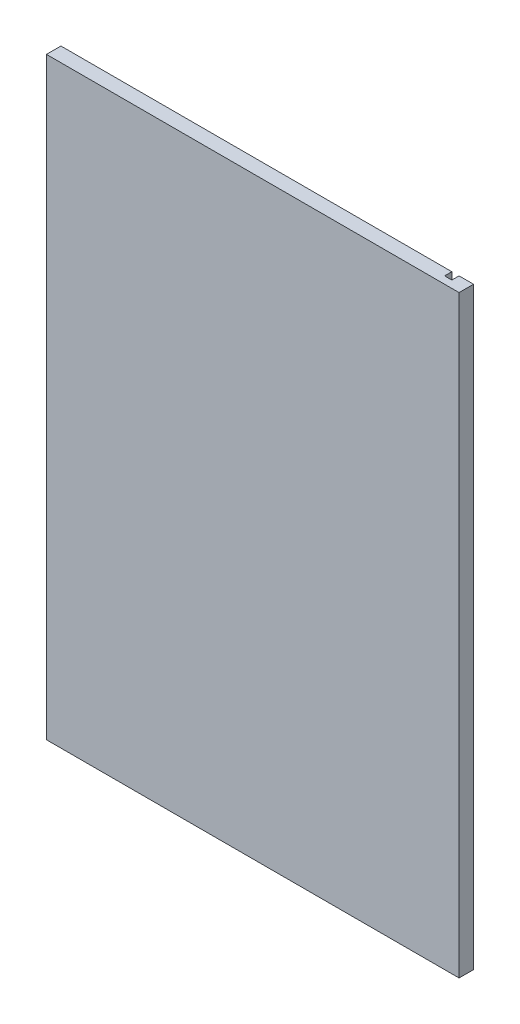
ISO-10303-21;
HEADER;
FILE_DESCRIPTION(('STEP AP214'),'2;1');
FILE_NAME('part.step','',(''),(''),'','','');
FILE_SCHEMA(('AUTOMOTIVE_DESIGN { 1 0 10303 214 1 1 1 1 }'));
ENDSEC;
DATA;
#1=APPLICATION_CONTEXT('core data for automotive mechanical design processes');
#2=APPLICATION_PROTOCOL_DEFINITION('international standard','automotive_design',2000,#1);
#3=PRODUCT_CONTEXT('',#1,'mechanical');
#4=PRODUCT('Part','Part','',(#3));
#5=PRODUCT_RELATED_PRODUCT_CATEGORY('part','',(#4));
#6=PRODUCT_DEFINITION_FORMATION('','',#4);
#7=PRODUCT_DEFINITION_CONTEXT('part definition',#1,'design');
#8=PRODUCT_DEFINITION('design','',#6,#7);
#9=PRODUCT_DEFINITION_SHAPE('','',#8);
#10=(LENGTH_UNIT() NAMED_UNIT(*) SI_UNIT(.MILLI.,.METRE.));
#11=(NAMED_UNIT(*) PLANE_ANGLE_UNIT() SI_UNIT($,.RADIAN.));
#12=(NAMED_UNIT(*) SI_UNIT($,.STERADIAN.) SOLID_ANGLE_UNIT());
#13=UNCERTAINTY_MEASURE_WITH_UNIT(LENGTH_MEASURE(1.E-05),#10,'distance_accuracy_value','');
#14=(GEOMETRIC_REPRESENTATION_CONTEXT(3) GLOBAL_UNCERTAINTY_ASSIGNED_CONTEXT((#13)) GLOBAL_UNIT_ASSIGNED_CONTEXT((#10,
#11,#12)) REPRESENTATION_CONTEXT('',''));
#15=CARTESIAN_POINT('',(0.,0.,0.));
#16=DIRECTION('',(0.,0.,1.));
#17=DIRECTION('',(1.,0.,0.));
#18=AXIS2_PLACEMENT_3D('',#15,#16,#17);
#19=CARTESIAN_POINT('',(0.,0.,0.));
#20=DIRECTION('',(0.,0.,1.));
#21=DIRECTION('',(1.,0.,0.));
#22=AXIS2_PLACEMENT_3D('',#19,#20,#21);
#23=PLANE('',#22);
#24=DIRECTION('',(1.,0.,0.));
#25=VECTOR('',#24,1.);
#26=CARTESIAN_POINT('',(0.,0.,0.));
#27=LINE('',#26,#25);
#28=CARTESIAN_POINT('',(-10.,0.,0.));
#29=VERTEX_POINT('',#28);
#30=CARTESIAN_POINT('',(0.,0.,0.));
#31=VERTEX_POINT('',#30);
#32=EDGE_CURVE('E77',#29,#31,#27,.T.);
#33=ORIENTED_EDGE('',*,*,#32,.F.);
#34=DIRECTION('',(0.,-1.,0.));
#35=VECTOR('',#34,1.);
#36=CARTESIAN_POINT('',(-10.,410.,0.));
#37=LINE('',#36,#35);
#38=CARTESIAN_POINT('',(-10.,410.,0.));
#39=VERTEX_POINT('',#38);
#40=EDGE_CURVE('E110',#39,#29,#37,.T.);
#41=ORIENTED_EDGE('',*,*,#40,.F.);
#42=DIRECTION('',(-1.,0.,0.));
#43=VECTOR('',#42,1.);
#44=CARTESIAN_POINT('',(0.,410.,0.));
#45=LINE('',#44,#43);
#46=CARTESIAN_POINT('',(0.,410.,0.));
#47=VERTEX_POINT('',#46);
#48=EDGE_CURVE('E150',#47,#39,#45,.T.);
#49=ORIENTED_EDGE('',*,*,#48,.F.);
#50=DIRECTION('',(0.,1.,0.));
#51=VECTOR('',#50,1.);
#52=CARTESIAN_POINT('',(0.,0.,0.));
#53=LINE('',#52,#51);
#54=EDGE_CURVE('E134',#31,#47,#53,.T.);
#55=ORIENTED_EDGE('',*,*,#54,.F.);
#56=EDGE_LOOP('',(#33,#41,#49,#55));
#57=FACE_BOUND('',#56,.T.);
#58=ADVANCED_FACE('F32',(#57),#23,.F.);
#59=CARTESIAN_POINT('',(0.,0.,10.));
#60=DIRECTION('',(-1.,0.,0.));
#61=DIRECTION('',(0.,0.,1.));
#62=AXIS2_PLACEMENT_3D('',#59,#60,#61);
#63=PLANE('',#62);
#64=ORIENTED_EDGE('',*,*,#54,.T.);
#65=DIRECTION('',(0.,0.,-1.));
#66=VECTOR('',#65,1.);
#67=CARTESIAN_POINT('',(0.,410.,10.));
#68=LINE('',#67,#66);
#69=CARTESIAN_POINT('',(0.,410.,10.));
#70=VERTEX_POINT('',#69);
#71=EDGE_CURVE('E11',#70,#47,#68,.T.);
#72=ORIENTED_EDGE('',*,*,#71,.F.);
#73=DIRECTION('',(0.,1.,0.));
#74=VECTOR('',#73,1.);
#75=CARTESIAN_POINT('',(0.,0.,10.));
#76=LINE('',#75,#74);
#77=CARTESIAN_POINT('',(0.,0.,10.));
#78=VERTEX_POINT('',#77);
#79=EDGE_CURVE('E139',#78,#70,#76,.T.);
#80=ORIENTED_EDGE('',*,*,#79,.F.);
#81=DIRECTION('',(0.,0.,-1.));
#82=VECTOR('',#81,1.);
#83=CARTESIAN_POINT('',(0.,0.,10.));
#84=LINE('',#83,#82);
#85=EDGE_CURVE('E146',#78,#31,#84,.T.);
#86=ORIENTED_EDGE('',*,*,#85,.T.);
#87=EDGE_LOOP('',(#64,#72,#80,#86));
#88=FACE_BOUND('',#87,.T.);
#89=ADVANCED_FACE('F34',(#88),#63,.F.);
#90=CARTESIAN_POINT('',(0.,410.,10.));
#91=DIRECTION('',(0.,-1.,0.));
#92=DIRECTION('',(1.,0.,0.));
#93=AXIS2_PLACEMENT_3D('',#90,#91,#92);
#94=PLANE('',#93);
#95=ORIENTED_EDGE('',*,*,#48,.T.);
#96=DIRECTION('',(0.,0.,-1.));
#97=VECTOR('',#96,1.);
#98=CARTESIAN_POINT('',(-10.,410.,5.));
#99=LINE('',#98,#97);
#100=CARTESIAN_POINT('',(-10.,410.,5.));
#101=VERTEX_POINT('',#100);
#102=EDGE_CURVE('E132',#101,#39,#99,.T.);
#103=ORIENTED_EDGE('',*,*,#102,.F.);
#104=DIRECTION('',(1.,0.,0.));
#105=VECTOR('',#104,1.);
#106=CARTESIAN_POINT('',(-10.,410.,5.));
#107=LINE('',#106,#105);
#108=CARTESIAN_POINT('',(-15.,410.,5.));
#109=VERTEX_POINT('',#108);
#110=EDGE_CURVE('E112',#109,#101,#107,.T.);
#111=ORIENTED_EDGE('',*,*,#110,.F.);
#112=DIRECTION('',(0.,0.,-1.));
#113=VECTOR('',#112,1.);
#114=CARTESIAN_POINT('',(-15.,410.,5.));
#115=LINE('',#114,#113);
#116=CARTESIAN_POINT('',(-15.,410.,0.));
#117=VERTEX_POINT('',#116);
#118=EDGE_CURVE('E135',#109,#117,#115,.T.);
#119=ORIENTED_EDGE('',*,*,#118,.T.);
#120=CARTESIAN_POINT('',(-285.,410.,0.));
#121=VERTEX_POINT('',#120);
#122=EDGE_CURVE('E149',#117,#121,#45,.T.);
#123=ORIENTED_EDGE('',*,*,#122,.T.);
#124=DIRECTION('',(0.,0.,-1.));
#125=VECTOR('',#124,1.);
#126=CARTESIAN_POINT('',(-285.,410.,10.));
#127=LINE('',#126,#125);
#128=CARTESIAN_POINT('',(-285.,410.,10.));
#129=VERTEX_POINT('',#128);
#130=EDGE_CURVE('E40',#129,#121,#127,.T.);
#131=ORIENTED_EDGE('',*,*,#130,.F.);
#132=DIRECTION('',(-1.,0.,0.));
#133=VECTOR('',#132,1.);
#134=CARTESIAN_POINT('',(0.,410.,10.));
#135=LINE('',#134,#133);
#136=EDGE_CURVE('E84',#70,#129,#135,.T.);
#137=ORIENTED_EDGE('',*,*,#136,.F.);
#138=ORIENTED_EDGE('',*,*,#71,.T.);
#139=EDGE_LOOP('',(#95,#103,#111,#119,#123,#131,#137,#138));
#140=FACE_BOUND('',#139,.T.);
#141=ADVANCED_FACE('F188',(#140),#94,.F.);
#142=CARTESIAN_POINT('',(-285.,0.,10.));
#143=DIRECTION('',(1.,0.,0.));
#144=DIRECTION('',(0.,0.,-1.));
#145=AXIS2_PLACEMENT_3D('',#142,#143,#144);
#146=PLANE('',#145);
#147=DIRECTION('',(0.,-1.,0.));
#148=VECTOR('',#147,1.);
#149=CARTESIAN_POINT('',(-285.,0.,0.));
#150=LINE('',#149,#148);
#151=CARTESIAN_POINT('',(-285.,0.,0.));
#152=VERTEX_POINT('',#151);
#153=EDGE_CURVE('E153',#121,#152,#150,.T.);
#154=ORIENTED_EDGE('',*,*,#153,.T.);
#155=DIRECTION('',(0.,0.,-1.));
#156=VECTOR('',#155,1.);
#157=CARTESIAN_POINT('',(-285.,0.,10.));
#158=LINE('',#157,#156);
#159=CARTESIAN_POINT('',(-285.,0.,10.));
#160=VERTEX_POINT('',#159);
#161=EDGE_CURVE('E157',#160,#152,#158,.T.);
#162=ORIENTED_EDGE('',*,*,#161,.F.);
#163=DIRECTION('',(0.,-1.,0.));
#164=VECTOR('',#163,1.);
#165=CARTESIAN_POINT('',(-285.,0.,10.));
#166=LINE('',#165,#164);
#167=EDGE_CURVE('E143',#129,#160,#166,.T.);
#168=ORIENTED_EDGE('',*,*,#167,.F.);
#169=ORIENTED_EDGE('',*,*,#130,.T.);
#170=EDGE_LOOP('',(#154,#162,#168,#169));
#171=FACE_BOUND('',#170,.T.);
#172=ADVANCED_FACE('F163',(#171),#146,.F.);
#173=CARTESIAN_POINT('',(0.,0.,10.));
#174=DIRECTION('',(0.,1.,0.));
#175=DIRECTION('',(-1.,0.,0.));
#176=AXIS2_PLACEMENT_3D('',#173,#174,#175);
#177=PLANE('',#176);
#178=DIRECTION('',(-1.,0.,0.));
#179=VECTOR('',#178,1.);
#180=CARTESIAN_POINT('',(-10.,0.,5.));
#181=LINE('',#180,#179);
#182=CARTESIAN_POINT('',(-10.,0.,5.));
#183=VERTEX_POINT('',#182);
#184=CARTESIAN_POINT('',(-15.0000000000001,0.,5.));
#185=VERTEX_POINT('',#184);
#186=EDGE_CURVE('E118',#183,#185,#181,.T.);
#187=ORIENTED_EDGE('',*,*,#186,.F.);
#188=DIRECTION('',(0.,0.,-1.));
#189=VECTOR('',#188,1.);
#190=CARTESIAN_POINT('',(-10.,0.,5.));
#191=LINE('',#190,#189);
#192=EDGE_CURVE('E104',#183,#29,#191,.T.);
#193=ORIENTED_EDGE('',*,*,#192,.T.);
#194=ORIENTED_EDGE('',*,*,#32,.T.);
#195=ORIENTED_EDGE('',*,*,#85,.F.);
#196=DIRECTION('',(1.,0.,0.));
#197=VECTOR('',#196,1.);
#198=CARTESIAN_POINT('',(0.,0.,10.));
#199=LINE('',#198,#197);
#200=EDGE_CURVE('E56',#160,#78,#199,.T.);
#201=ORIENTED_EDGE('',*,*,#200,.F.);
#202=ORIENTED_EDGE('',*,*,#161,.T.);
#203=CARTESIAN_POINT('',(-15.0000000000001,0.,0.));
#204=VERTEX_POINT('',#203);
#205=EDGE_CURVE('E141',#152,#204,#27,.T.);
#206=ORIENTED_EDGE('',*,*,#205,.T.);
#207=DIRECTION('',(0.,0.,-1.));
#208=VECTOR('',#207,1.);
#209=CARTESIAN_POINT('',(-15.0000000000001,0.,5.));
#210=LINE('',#209,#208);
#211=EDGE_CURVE('E47',#185,#204,#210,.T.);
#212=ORIENTED_EDGE('',*,*,#211,.F.);
#213=EDGE_LOOP('',(#187,#193,#194,#195,#201,#202,#206,#212));
#214=FACE_BOUND('',#213,.T.);
#215=ADVANCED_FACE('F123',(#214),#177,.F.);
#216=CARTESIAN_POINT('',(0.,0.,10.));
#217=DIRECTION('',(0.,0.,1.));
#218=DIRECTION('',(1.,0.,0.));
#219=AXIS2_PLACEMENT_3D('',#216,#217,#218);
#220=PLANE('',#219);
#221=ORIENTED_EDGE('',*,*,#79,.T.);
#222=ORIENTED_EDGE('',*,*,#136,.T.);
#223=ORIENTED_EDGE('',*,*,#167,.T.);
#224=ORIENTED_EDGE('',*,*,#200,.T.);
#225=EDGE_LOOP('',(#221,#222,#223,#224));
#226=FACE_BOUND('',#225,.T.);
#227=ADVANCED_FACE('F173',(#226),#220,.T.);
#228=ORIENTED_EDGE('',*,*,#122,.F.);
#229=DIRECTION('',(0.,1.,0.));
#230=VECTOR('',#229,1.);
#231=CARTESIAN_POINT('',(-15.,410.,0.));
#232=LINE('',#231,#230);
#233=EDGE_CURVE('E121',#204,#117,#232,.T.);
#234=ORIENTED_EDGE('',*,*,#233,.F.);
#235=ORIENTED_EDGE('',*,*,#205,.F.);
#236=ORIENTED_EDGE('',*,*,#153,.F.);
#237=EDGE_LOOP('',(#228,#234,#235,#236));
#238=FACE_BOUND('',#237,.T.);
#239=ADVANCED_FACE('F168',(#238),#23,.F.);
#240=CARTESIAN_POINT('',(-10.,410.,5.));
#241=DIRECTION('',(1.,0.,0.));
#242=DIRECTION('',(0.,1.,0.));
#243=AXIS2_PLACEMENT_3D('',#240,#241,#242);
#244=PLANE('',#243);
#245=ORIENTED_EDGE('',*,*,#40,.T.);
#246=ORIENTED_EDGE('',*,*,#192,.F.);
#247=DIRECTION('',(0.,-1.,0.));
#248=VECTOR('',#247,1.);
#249=CARTESIAN_POINT('',(-10.,410.,5.));
#250=LINE('',#249,#248);
#251=EDGE_CURVE('E107',#101,#183,#250,.T.);
#252=ORIENTED_EDGE('',*,*,#251,.F.);
#253=ORIENTED_EDGE('',*,*,#102,.T.);
#254=EDGE_LOOP('',(#245,#246,#252,#253));
#255=FACE_BOUND('',#254,.T.);
#256=ADVANCED_FACE('F106',(#255),#244,.F.);
#257=CARTESIAN_POINT('',(-15.,410.,5.));
#258=DIRECTION('',(-1.,0.,0.));
#259=DIRECTION('',(0.,-1.,0.));
#260=AXIS2_PLACEMENT_3D('',#257,#258,#259);
#261=PLANE('',#260);
#262=ORIENTED_EDGE('',*,*,#233,.T.);
#263=ORIENTED_EDGE('',*,*,#118,.F.);
#264=DIRECTION('',(0.,1.,0.));
#265=VECTOR('',#264,1.);
#266=CARTESIAN_POINT('',(-15.,410.,5.));
#267=LINE('',#266,#265);
#268=EDGE_CURVE('E125',#185,#109,#267,.T.);
#269=ORIENTED_EDGE('',*,*,#268,.F.);
#270=ORIENTED_EDGE('',*,*,#211,.T.);
#271=EDGE_LOOP('',(#262,#263,#269,#270));
#272=FACE_BOUND('',#271,.T.);
#273=ADVANCED_FACE('F194',(#272),#261,.F.);
#274=CARTESIAN_POINT('',(0.,0.,5.));
#275=DIRECTION('',(0.,0.,-1.));
#276=DIRECTION('',(-1.,0.,0.));
#277=AXIS2_PLACEMENT_3D('',#274,#275,#276);
#278=PLANE('',#277);
#279=ORIENTED_EDGE('',*,*,#251,.T.);
#280=ORIENTED_EDGE('',*,*,#186,.T.);
#281=ORIENTED_EDGE('',*,*,#268,.T.);
#282=ORIENTED_EDGE('',*,*,#110,.T.);
#283=EDGE_LOOP('',(#279,#280,#281,#282));
#284=FACE_BOUND('',#283,.T.);
#285=ADVANCED_FACE('F116',(#284),#278,.T.);
#286=CLOSED_SHELL('',(#58,#89,#141,#172,#215,#227,#239,#256,#273,#285));
#287=MANIFOLD_SOLID_BREP('B2',#286);
#288=ADVANCED_BREP_SHAPE_REPRESENTATION('',(#18,#287),#14);
#289=SHAPE_DEFINITION_REPRESENTATION(#9,#288);
ENDSEC;
END-ISO-10303-21;
